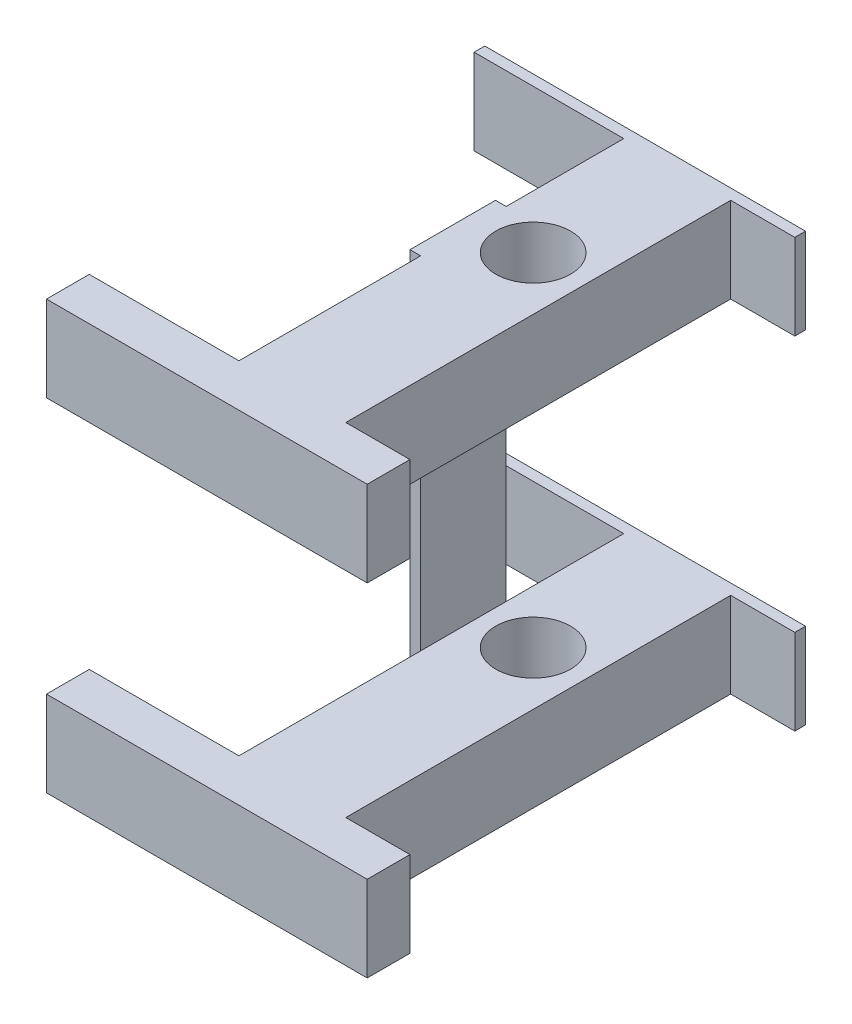
ISO-10303-21;
HEADER;
FILE_DESCRIPTION(('STEP AP214'),'2;1');
FILE_NAME('part.step','',(''),(''),'','','');
FILE_SCHEMA(('AUTOMOTIVE_DESIGN { 1 0 10303 214 1 1 1 1 }'));
ENDSEC;
DATA;
#1=APPLICATION_CONTEXT('core data for automotive mechanical design processes');
#2=APPLICATION_PROTOCOL_DEFINITION('international standard','automotive_design',2000,#1);
#3=PRODUCT_CONTEXT('',#1,'mechanical');
#4=PRODUCT('Part','Part','',(#3));
#5=PRODUCT_RELATED_PRODUCT_CATEGORY('part','',(#4));
#6=PRODUCT_DEFINITION_FORMATION('','',#4);
#7=PRODUCT_DEFINITION_CONTEXT('part definition',#1,'design');
#8=PRODUCT_DEFINITION('design','',#6,#7);
#9=PRODUCT_DEFINITION_SHAPE('','',#8);
#10=(LENGTH_UNIT() NAMED_UNIT(*) SI_UNIT(.MILLI.,.METRE.));
#11=(NAMED_UNIT(*) PLANE_ANGLE_UNIT() SI_UNIT($,.RADIAN.));
#12=(NAMED_UNIT(*) SI_UNIT($,.STERADIAN.) SOLID_ANGLE_UNIT());
#13=UNCERTAINTY_MEASURE_WITH_UNIT(LENGTH_MEASURE(1.E-05),#10,'distance_accuracy_value','');
#14=(GEOMETRIC_REPRESENTATION_CONTEXT(3) GLOBAL_UNCERTAINTY_ASSIGNED_CONTEXT((#13)) GLOBAL_UNIT_ASSIGNED_CONTEXT((#10,
#11,#12)) REPRESENTATION_CONTEXT('',''));
#15=CARTESIAN_POINT('',(0.,0.,0.));
#16=DIRECTION('',(0.,0.,1.));
#17=DIRECTION('',(1.,0.,0.));
#18=AXIS2_PLACEMENT_3D('',#15,#16,#17);
#19=CARTESIAN_POINT('',(88.9,0.,0.));
#20=DIRECTION('',(-1.,0.,0.));
#21=DIRECTION('',(0.,0.,1.));
#22=AXIS2_PLACEMENT_3D('',#19,#20,#21);
#23=PLANE('',#22);
#24=DIRECTION('',(0.,0.,-1.));
#25=VECTOR('',#24,1.);
#26=CARTESIAN_POINT('',(88.9,203.2,0.));
#27=LINE('',#26,#25);
#28=CARTESIAN_POINT('',(88.9,203.2,-107.95));
#29=VERTEX_POINT('',#28);
#30=CARTESIAN_POINT('',(88.9,203.2,-158.75));
#31=VERTEX_POINT('',#30);
#32=EDGE_CURVE('E63',#29,#31,#27,.T.);
#33=ORIENTED_EDGE('',*,*,#32,.F.);
#34=DIRECTION('',(0.,1.,0.));
#35=VECTOR('',#34,1.);
#36=CARTESIAN_POINT('',(88.9,0.,-107.95));
#37=LINE('',#36,#35);
#38=CARTESIAN_POINT('',(88.9,50.8,-107.95));
#39=VERTEX_POINT('',#38);
#40=EDGE_CURVE('E370',#39,#29,#37,.T.);
#41=ORIENTED_EDGE('',*,*,#40,.F.);
#42=DIRECTION('',(0.,0.,-1.));
#43=VECTOR('',#42,1.);
#44=CARTESIAN_POINT('',(88.9,50.8,0.));
#45=LINE('',#44,#43);
#46=CARTESIAN_POINT('',(88.9,50.8,-158.75));
#47=VERTEX_POINT('',#46);
#48=EDGE_CURVE('E470',#39,#47,#45,.T.);
#49=ORIENTED_EDGE('',*,*,#48,.T.);
#50=DIRECTION('',(0.,-1.,0.));
#51=VECTOR('',#50,1.);
#52=CARTESIAN_POINT('',(88.9,0.,-158.75));
#53=LINE('',#52,#51);
#54=EDGE_CURVE('E390',#31,#47,#53,.T.);
#55=ORIENTED_EDGE('',*,*,#54,.F.);
#56=EDGE_LOOP('',(#33,#41,#49,#55));
#57=FACE_BOUND('',#56,.T.);
#58=ADVANCED_FACE('F47',(#57),#23,.F.);
#59=CARTESIAN_POINT('',(88.9,50.8,0.));
#60=DIRECTION('',(-1.,0.,0.));
#61=DIRECTION('',(0.,0.,1.));
#62=AXIS2_PLACEMENT_3D('',#59,#60,#61);
#63=PLANE('',#62);
#64=CARTESIAN_POINT('',(88.9,50.8,0.));
#65=VERTEX_POINT('',#64);
#66=EDGE_CURVE('E465',#65,#39,#45,.T.);
#67=ORIENTED_EDGE('',*,*,#66,.T.);
#68=CARTESIAN_POINT('',(88.9,0.,-107.95));
#69=VERTEX_POINT('',#68);
#70=EDGE_CURVE('E386',#69,#39,#37,.T.);
#71=ORIENTED_EDGE('',*,*,#70,.F.);
#72=DIRECTION('',(0.,0.,-1.));
#73=VECTOR('',#72,1.);
#74=CARTESIAN_POINT('',(88.9,0.,0.));
#75=LINE('',#74,#73);
#76=CARTESIAN_POINT('',(88.9,0.,0.));
#77=VERTEX_POINT('',#76);
#78=EDGE_CURVE('E464',#77,#69,#75,.T.);
#79=ORIENTED_EDGE('',*,*,#78,.F.);
#80=DIRECTION('',(0.,-1.,0.));
#81=VECTOR('',#80,1.);
#82=CARTESIAN_POINT('',(88.9,50.8,0.));
#83=LINE('',#82,#81);
#84=EDGE_CURVE('E482',#65,#77,#83,.T.);
#85=ORIENTED_EDGE('',*,*,#84,.F.);
#86=EDGE_LOOP('',(#67,#71,#79,#85));
#87=FACE_BOUND('',#86,.T.);
#88=ADVANCED_FACE('F546',(#87),#63,.T.);
#89=CARTESIAN_POINT('',(88.9,0.,-158.75));
#90=VERTEX_POINT('',#89);
#91=CARTESIAN_POINT('',(88.9,0.,-228.6));
#92=VERTEX_POINT('',#91);
#93=EDGE_CURVE('E473',#90,#92,#75,.T.);
#94=ORIENTED_EDGE('',*,*,#93,.F.);
#95=DIRECTION('',(0.,1.,0.));
#96=VECTOR('',#95,1.);
#97=CARTESIAN_POINT('',(88.9,50.8,-158.75));
#98=LINE('',#97,#96);
#99=EDGE_CURVE('E11',#90,#47,#98,.T.);
#100=ORIENTED_EDGE('',*,*,#99,.T.);
#101=CARTESIAN_POINT('',(88.9,50.8,-228.6));
#102=VERTEX_POINT('',#101);
#103=EDGE_CURVE('E463',#47,#102,#45,.T.);
#104=ORIENTED_EDGE('',*,*,#103,.T.);
#105=DIRECTION('',(0.,-1.,0.));
#106=VECTOR('',#105,1.);
#107=CARTESIAN_POINT('',(88.9,50.8,-228.6));
#108=LINE('',#107,#106);
#109=EDGE_CURVE('E477',#102,#92,#108,.T.);
#110=ORIENTED_EDGE('',*,*,#109,.T.);
#111=EDGE_LOOP('',(#94,#100,#104,#110));
#112=FACE_BOUND('',#111,.T.);
#113=ADVANCED_FACE('F560',(#112),#63,.T.);
#114=CARTESIAN_POINT('',(0.,0.,0.));
#115=DIRECTION('',(0.,0.,-1.));
#116=DIRECTION('',(-1.,0.,0.));
#117=AXIS2_PLACEMENT_3D('',#114,#115,#116);
#118=PLANE('',#117);
#119=DIRECTION('',(-1.,0.,0.));
#120=VECTOR('',#119,1.);
#121=CARTESIAN_POINT('',(0.,50.8,0.));
#122=LINE('',#121,#120);
#123=CARTESIAN_POINT('',(0.,50.8,0.));
#124=VERTEX_POINT('',#123);
#125=EDGE_CURVE('E518',#65,#124,#122,.T.);
#126=ORIENTED_EDGE('',*,*,#125,.F.);
#127=ORIENTED_EDGE('',*,*,#84,.T.);
#128=DIRECTION('',(1.,0.,0.));
#129=VECTOR('',#128,1.);
#130=CARTESIAN_POINT('',(0.,0.,0.));
#131=LINE('',#130,#129);
#132=CARTESIAN_POINT('',(0.,0.,0.));
#133=VERTEX_POINT('',#132);
#134=EDGE_CURVE('E511',#133,#77,#131,.T.);
#135=ORIENTED_EDGE('',*,*,#134,.F.);
#136=DIRECTION('',(0.,-1.,0.));
#137=VECTOR('',#136,1.);
#138=CARTESIAN_POINT('',(0.,0.,0.));
#139=LINE('',#138,#137);
#140=EDGE_CURVE('E481',#124,#133,#139,.T.);
#141=ORIENTED_EDGE('',*,*,#140,.F.);
#142=EDGE_LOOP('',(#126,#127,#135,#141));
#143=FACE_BOUND('',#142,.T.);
#144=ADVANCED_FACE('F543',(#143),#118,.T.);
#145=CARTESIAN_POINT('',(0.,0.,25.4));
#146=DIRECTION('',(1.,0.,0.));
#147=DIRECTION('',(0.,0.,-1.));
#148=AXIS2_PLACEMENT_3D('',#145,#146,#147);
#149=PLANE('',#148);
#150=ORIENTED_EDGE('',*,*,#140,.T.);
#151=DIRECTION('',(0.,0.,-1.));
#152=VECTOR('',#151,1.);
#153=CARTESIAN_POINT('',(0.,0.,25.4));
#154=LINE('',#153,#152);
#155=CARTESIAN_POINT('',(0.,0.,25.4));
#156=VERTEX_POINT('',#155);
#157=EDGE_CURVE('E56',#156,#133,#154,.T.);
#158=ORIENTED_EDGE('',*,*,#157,.F.);
#159=DIRECTION('',(0.,-1.,0.));
#160=VECTOR('',#159,1.);
#161=CARTESIAN_POINT('',(0.,0.,25.4));
#162=LINE('',#161,#160);
#163=CARTESIAN_POINT('',(0.,50.8,25.4));
#164=VERTEX_POINT('',#163);
#165=EDGE_CURVE('E492',#164,#156,#162,.T.);
#166=ORIENTED_EDGE('',*,*,#165,.F.);
#167=DIRECTION('',(0.,0.,-1.));
#168=VECTOR('',#167,1.);
#169=CARTESIAN_POINT('',(0.,50.8,25.4));
#170=LINE('',#169,#168);
#171=EDGE_CURVE('E506',#164,#124,#170,.T.);
#172=ORIENTED_EDGE('',*,*,#171,.T.);
#173=EDGE_LOOP('',(#150,#158,#166,#172));
#174=FACE_BOUND('',#173,.T.);
#175=ADVANCED_FACE('F49',(#174),#149,.F.);
#176=CARTESIAN_POINT('',(0.,0.,25.4));
#177=DIRECTION('',(0.,1.,0.));
#178=DIRECTION('',(0.,0.,1.));
#179=AXIS2_PLACEMENT_3D('',#176,#177,#178);
#180=PLANE('',#179);
#181=CARTESIAN_POINT('',(120.65,0.,-143.027799697215));
#182=DIRECTION('',(0.,-1.,0.));
#183=DIRECTION('',(0.,0.,-1.));
#184=AXIS2_PLACEMENT_3D('',#181,#182,#183);
#185=CIRCLE('',#184,22.225);
#186=CARTESIAN_POINT('',(120.65,0.,-165.252799697215));
#187=VERTEX_POINT('',#186);
#188=EDGE_CURVE('E405',#187,#187,#185,.T.);
#189=ORIENTED_EDGE('',*,*,#188,.F.);
#190=EDGE_LOOP('',(#189));
#191=FACE_BOUND('',#190,.T.);
#192=ORIENTED_EDGE('',*,*,#134,.T.);
#193=ORIENTED_EDGE('',*,*,#78,.T.);
#194=DIRECTION('',(1.,0.,0.));
#195=VECTOR('',#194,1.);
#196=CARTESIAN_POINT('',(82.55,0.,-107.95));
#197=LINE('',#196,#195);
#198=CARTESIAN_POINT('',(82.55,0.,-107.95));
#199=VERTEX_POINT('',#198);
#200=EDGE_CURVE('E385',#199,#69,#197,.T.);
#201=ORIENTED_EDGE('',*,*,#200,.F.);
#202=DIRECTION('',(0.,0.,1.));
#203=VECTOR('',#202,1.);
#204=CARTESIAN_POINT('',(82.55,0.,-107.95));
#205=LINE('',#204,#203);
#206=CARTESIAN_POINT('',(82.55,0.,-158.75));
#207=VERTEX_POINT('',#206);
#208=EDGE_CURVE('E382',#207,#199,#205,.T.);
#209=ORIENTED_EDGE('',*,*,#208,.F.);
#210=DIRECTION('',(1.,0.,0.));
#211=VECTOR('',#210,1.);
#212=CARTESIAN_POINT('',(82.55,0.,-158.75));
#213=LINE('',#212,#211);
#214=EDGE_CURVE('E71',#207,#90,#213,.T.);
#215=ORIENTED_EDGE('',*,*,#214,.T.);
#216=ORIENTED_EDGE('',*,*,#93,.T.);
#217=DIRECTION('',(-1.,0.,0.));
#218=VECTOR('',#217,1.);
#219=CARTESIAN_POINT('',(190.5,0.,-228.6));
#220=LINE('',#219,#218);
#221=CARTESIAN_POINT('',(0.,0.,-228.6));
#222=VERTEX_POINT('',#221);
#223=EDGE_CURVE('E432',#92,#222,#220,.T.);
#224=ORIENTED_EDGE('',*,*,#223,.T.);
#225=DIRECTION('',(0.,0.,1.));
#226=VECTOR('',#225,1.);
#227=CARTESIAN_POINT('',(0.,0.,-234.95));
#228=LINE('',#227,#226);
#229=CARTESIAN_POINT('',(0.,0.,-234.95));
#230=VERTEX_POINT('',#229);
#231=EDGE_CURVE('E451',#230,#222,#228,.T.);
#232=ORIENTED_EDGE('',*,*,#231,.F.);
#233=DIRECTION('',(-1.,0.,0.));
#234=VECTOR('',#233,1.);
#235=CARTESIAN_POINT('',(190.5,0.,-234.95));
#236=LINE('',#235,#234);
#237=CARTESIAN_POINT('',(190.5,0.,-234.95));
#238=VERTEX_POINT('',#237);
#239=EDGE_CURVE('E418',#238,#230,#236,.T.);
#240=ORIENTED_EDGE('',*,*,#239,.F.);
#241=DIRECTION('',(0.,0.,1.));
#242=VECTOR('',#241,1.);
#243=CARTESIAN_POINT('',(190.5,0.,-234.95));
#244=LINE('',#243,#242);
#245=CARTESIAN_POINT('',(190.5,0.,-228.6));
#246=VERTEX_POINT('',#245);
#247=EDGE_CURVE('E455',#238,#246,#244,.T.);
#248=ORIENTED_EDGE('',*,*,#247,.T.);
#249=CARTESIAN_POINT('',(152.4,0.,-228.6));
#250=VERTEX_POINT('',#249);
#251=EDGE_CURVE('E433',#246,#250,#220,.T.);
#252=ORIENTED_EDGE('',*,*,#251,.T.);
#253=DIRECTION('',(0.,0.,-1.));
#254=VECTOR('',#253,1.);
#255=CARTESIAN_POINT('',(152.4,0.,0.));
#256=LINE('',#255,#254);
#257=CARTESIAN_POINT('',(152.4,0.,0.));
#258=VERTEX_POINT('',#257);
#259=EDGE_CURVE('E459',#258,#250,#256,.T.);
#260=ORIENTED_EDGE('',*,*,#259,.F.);
#261=CARTESIAN_POINT('',(190.5,0.,0.));
#262=VERTEX_POINT('',#261);
#263=EDGE_CURVE('E510',#258,#262,#131,.T.);
#264=ORIENTED_EDGE('',*,*,#263,.T.);
#265=DIRECTION('',(0.,0.,-1.));
#266=VECTOR('',#265,1.);
#267=CARTESIAN_POINT('',(190.5,0.,25.4));
#268=LINE('',#267,#266);
#269=CARTESIAN_POINT('',(190.5,0.,25.4));
#270=VERTEX_POINT('',#269);
#271=EDGE_CURVE('E529',#270,#262,#268,.T.);
#272=ORIENTED_EDGE('',*,*,#271,.F.);
#273=DIRECTION('',(1.,0.,0.));
#274=VECTOR('',#273,1.);
#275=CARTESIAN_POINT('',(0.,0.,25.4));
#276=LINE('',#275,#274);
#277=EDGE_CURVE('E496',#156,#270,#276,.T.);
#278=ORIENTED_EDGE('',*,*,#277,.F.);
#279=ORIENTED_EDGE('',*,*,#157,.T.);
#280=EDGE_LOOP('',(#192,#193,#201,#209,#215,#216,#224,#232,#240,#248,#252,#260,#264,#272,#278,#279));
#281=FACE_BOUND('',#280,.T.);
#282=ADVANCED_FACE('F535',(#191,#281),#180,.F.);
#283=CARTESIAN_POINT('',(190.5,0.,25.4));
#284=DIRECTION('',(-1.,0.,0.));
#285=DIRECTION('',(0.,0.,1.));
#286=AXIS2_PLACEMENT_3D('',#283,#284,#285);
#287=PLANE('',#286);
#288=DIRECTION('',(0.,1.,0.));
#289=VECTOR('',#288,1.);
#290=CARTESIAN_POINT('',(190.5,0.,0.));
#291=LINE('',#290,#289);
#292=CARTESIAN_POINT('',(190.5,50.8,0.));
#293=VERTEX_POINT('',#292);
#294=EDGE_CURVE('E515',#262,#293,#291,.T.);
#295=ORIENTED_EDGE('',*,*,#294,.T.);
#296=DIRECTION('',(0.,0.,-1.));
#297=VECTOR('',#296,1.);
#298=CARTESIAN_POINT('',(190.5,50.8,25.4));
#299=LINE('',#298,#297);
#300=CARTESIAN_POINT('',(190.5,50.8,25.4));
#301=VERTEX_POINT('',#300);
#302=EDGE_CURVE('E525',#301,#293,#299,.T.);
#303=ORIENTED_EDGE('',*,*,#302,.F.);
#304=DIRECTION('',(0.,1.,0.));
#305=VECTOR('',#304,1.);
#306=CARTESIAN_POINT('',(190.5,0.,25.4));
#307=LINE('',#306,#305);
#308=EDGE_CURVE('E500',#270,#301,#307,.T.);
#309=ORIENTED_EDGE('',*,*,#308,.F.);
#310=ORIENTED_EDGE('',*,*,#271,.T.);
#311=EDGE_LOOP('',(#295,#303,#309,#310));
#312=FACE_BOUND('',#311,.T.);
#313=ADVANCED_FACE('F709',(#312),#287,.F.);
#314=CARTESIAN_POINT('',(0.,50.8,25.4));
#315=DIRECTION('',(0.,-1.,0.));
#316=DIRECTION('',(0.,0.,-1.));
#317=AXIS2_PLACEMENT_3D('',#314,#315,#316);
#318=PLANE('',#317);
#319=CARTESIAN_POINT('',(120.65,50.8,-143.027799697215));
#320=DIRECTION('',(0.,-1.,0.));
#321=DIRECTION('',(0.,0.,-1.));
#322=AXIS2_PLACEMENT_3D('',#319,#320,#321);
#323=CIRCLE('',#322,22.225);
#324=CARTESIAN_POINT('',(120.65,50.8,-165.252799697215));
#325=VERTEX_POINT('',#324);
#326=EDGE_CURVE('E406',#325,#325,#323,.T.);
#327=ORIENTED_EDGE('',*,*,#326,.T.);
#328=EDGE_LOOP('',(#327));
#329=FACE_BOUND('',#328,.T.);
#330=CARTESIAN_POINT('',(152.4,50.8,0.));
#331=VERTEX_POINT('',#330);
#332=EDGE_CURVE('E497',#293,#331,#122,.T.);
#333=ORIENTED_EDGE('',*,*,#332,.T.);
#334=DIRECTION('',(0.,0.,-1.));
#335=VECTOR('',#334,1.);
#336=CARTESIAN_POINT('',(152.4,50.8,0.));
#337=LINE('',#336,#335);
#338=CARTESIAN_POINT('',(152.4,50.8,-228.6));
#339=VERTEX_POINT('',#338);
#340=EDGE_CURVE('E460',#331,#339,#337,.T.);
#341=ORIENTED_EDGE('',*,*,#340,.T.);
#342=DIRECTION('',(1.,0.,0.));
#343=VECTOR('',#342,1.);
#344=CARTESIAN_POINT('',(190.5,50.8,-228.6));
#345=LINE('',#344,#343);
#346=CARTESIAN_POINT('',(190.5,50.8,-228.6));
#347=VERTEX_POINT('',#346);
#348=EDGE_CURVE('E440',#339,#347,#345,.T.);
#349=ORIENTED_EDGE('',*,*,#348,.T.);
#350=DIRECTION('',(0.,0.,1.));
#351=VECTOR('',#350,1.);
#352=CARTESIAN_POINT('',(190.5,50.8,-234.95));
#353=LINE('',#352,#351);
#354=CARTESIAN_POINT('',(190.5,50.8,-234.95));
#355=VERTEX_POINT('',#354);
#356=EDGE_CURVE('E428',#355,#347,#353,.T.);
#357=ORIENTED_EDGE('',*,*,#356,.F.);
#358=DIRECTION('',(1.,0.,0.));
#359=VECTOR('',#358,1.);
#360=CARTESIAN_POINT('',(190.5,50.8,-234.95));
#361=LINE('',#360,#359);
#362=CARTESIAN_POINT('',(0.,50.8,-234.95));
#363=VERTEX_POINT('',#362);
#364=EDGE_CURVE('E425',#363,#355,#361,.T.);
#365=ORIENTED_EDGE('',*,*,#364,.F.);
#366=DIRECTION('',(0.,0.,1.));
#367=VECTOR('',#366,1.);
#368=CARTESIAN_POINT('',(0.,50.8,-234.95));
#369=LINE('',#368,#367);
#370=CARTESIAN_POINT('',(0.,50.8,-228.6));
#371=VERTEX_POINT('',#370);
#372=EDGE_CURVE('E447',#363,#371,#369,.T.);
#373=ORIENTED_EDGE('',*,*,#372,.T.);
#374=EDGE_CURVE('E419',#371,#102,#345,.T.);
#375=ORIENTED_EDGE('',*,*,#374,.T.);
#376=ORIENTED_EDGE('',*,*,#103,.F.);
#377=ORIENTED_EDGE('',*,*,#48,.F.);
#378=ORIENTED_EDGE('',*,*,#66,.F.);
#379=ORIENTED_EDGE('',*,*,#125,.T.);
#380=ORIENTED_EDGE('',*,*,#171,.F.);
#381=DIRECTION('',(-1.,0.,0.));
#382=VECTOR('',#381,1.);
#383=CARTESIAN_POINT('',(0.,50.8,25.4));
#384=LINE('',#383,#382);
#385=EDGE_CURVE('E503',#301,#164,#384,.T.);
#386=ORIENTED_EDGE('',*,*,#385,.F.);
#387=ORIENTED_EDGE('',*,*,#302,.T.);
#388=EDGE_LOOP('',(#333,#341,#349,#357,#365,#373,#375,#376,#377,#378,#379,#380,#386,#387));
#389=FACE_BOUND('',#388,.T.);
#390=ADVANCED_FACE('F550',(#329,#389),#318,.F.);
#391=CARTESIAN_POINT('',(0.,0.,25.4));
#392=DIRECTION('',(0.,0.,-1.));
#393=DIRECTION('',(-1.,0.,0.));
#394=AXIS2_PLACEMENT_3D('',#391,#392,#393);
#395=PLANE('',#394);
#396=ORIENTED_EDGE('',*,*,#165,.T.);
#397=ORIENTED_EDGE('',*,*,#277,.T.);
#398=ORIENTED_EDGE('',*,*,#308,.T.);
#399=ORIENTED_EDGE('',*,*,#385,.T.);
#400=EDGE_LOOP('',(#396,#397,#398,#399));
#401=FACE_BOUND('',#400,.T.);
#402=ADVANCED_FACE('F700',(#401),#395,.F.);
#403=DIRECTION('',(0.,-1.,0.));
#404=VECTOR('',#403,1.);
#405=CARTESIAN_POINT('',(152.4,50.8,0.));
#406=LINE('',#405,#404);
#407=EDGE_CURVE('E486',#331,#258,#406,.T.);
#408=ORIENTED_EDGE('',*,*,#407,.F.);
#409=ORIENTED_EDGE('',*,*,#332,.F.);
#410=ORIENTED_EDGE('',*,*,#294,.F.);
#411=ORIENTED_EDGE('',*,*,#263,.F.);
#412=EDGE_LOOP('',(#408,#409,#410,#411));
#413=FACE_BOUND('',#412,.T.);
#414=ADVANCED_FACE('F698',(#413),#118,.T.);
#415=CARTESIAN_POINT('',(152.4,50.8,0.));
#416=DIRECTION('',(-1.,0.,0.));
#417=DIRECTION('',(0.,0.,1.));
#418=AXIS2_PLACEMENT_3D('',#415,#416,#417);
#419=PLANE('',#418);
#420=ORIENTED_EDGE('',*,*,#259,.T.);
#421=DIRECTION('',(0.,-1.,0.));
#422=VECTOR('',#421,1.);
#423=CARTESIAN_POINT('',(152.4,50.8,-228.6));
#424=LINE('',#423,#422);
#425=EDGE_CURVE('E469',#339,#250,#424,.T.);
#426=ORIENTED_EDGE('',*,*,#425,.F.);
#427=ORIENTED_EDGE('',*,*,#340,.F.);
#428=ORIENTED_EDGE('',*,*,#407,.T.);
#429=EDGE_LOOP('',(#420,#426,#427,#428));
#430=FACE_BOUND('',#429,.T.);
#431=ADVANCED_FACE('F695',(#430),#419,.F.);
#432=CARTESIAN_POINT('',(0.,0.,-228.6));
#433=DIRECTION('',(0.,0.,1.));
#434=DIRECTION('',(1.,0.,0.));
#435=AXIS2_PLACEMENT_3D('',#432,#433,#434);
#436=PLANE('',#435);
#437=ORIENTED_EDGE('',*,*,#109,.F.);
#438=ORIENTED_EDGE('',*,*,#374,.F.);
#439=DIRECTION('',(0.,1.,0.));
#440=VECTOR('',#439,1.);
#441=CARTESIAN_POINT('',(0.,0.,-228.6));
#442=LINE('',#441,#440);
#443=EDGE_CURVE('E437',#222,#371,#442,.T.);
#444=ORIENTED_EDGE('',*,*,#443,.F.);
#445=ORIENTED_EDGE('',*,*,#223,.F.);
#446=EDGE_LOOP('',(#437,#438,#444,#445));
#447=FACE_BOUND('',#446,.T.);
#448=ADVANCED_FACE('F564',(#447),#436,.T.);
#449=CARTESIAN_POINT('',(190.5,0.,-234.95));
#450=DIRECTION('',(-1.,0.,0.));
#451=DIRECTION('',(0.,0.,1.));
#452=AXIS2_PLACEMENT_3D('',#449,#450,#451);
#453=PLANE('',#452);
#454=DIRECTION('',(0.,-1.,0.));
#455=VECTOR('',#454,1.);
#456=CARTESIAN_POINT('',(190.5,0.,-228.6));
#457=LINE('',#456,#455);
#458=EDGE_CURVE('E410',#347,#246,#457,.T.);
#459=ORIENTED_EDGE('',*,*,#458,.T.);
#460=ORIENTED_EDGE('',*,*,#247,.F.);
#461=DIRECTION('',(0.,-1.,0.));
#462=VECTOR('',#461,1.);
#463=CARTESIAN_POINT('',(190.5,0.,-234.95));
#464=LINE('',#463,#462);
#465=EDGE_CURVE('E414',#355,#238,#464,.T.);
#466=ORIENTED_EDGE('',*,*,#465,.F.);
#467=ORIENTED_EDGE('',*,*,#356,.T.);
#468=EDGE_LOOP('',(#459,#460,#466,#467));
#469=FACE_BOUND('',#468,.T.);
#470=ADVANCED_FACE('F691',(#469),#453,.F.);
#471=CARTESIAN_POINT('',(0.,0.,-234.95));
#472=DIRECTION('',(1.,0.,0.));
#473=DIRECTION('',(0.,0.,-1.));
#474=AXIS2_PLACEMENT_3D('',#471,#472,#473);
#475=PLANE('',#474);
#476=ORIENTED_EDGE('',*,*,#443,.T.);
#477=ORIENTED_EDGE('',*,*,#372,.F.);
#478=DIRECTION('',(0.,1.,0.));
#479=VECTOR('',#478,1.);
#480=CARTESIAN_POINT('',(0.,0.,-234.95));
#481=LINE('',#480,#479);
#482=EDGE_CURVE('E422',#230,#363,#481,.T.);
#483=ORIENTED_EDGE('',*,*,#482,.F.);
#484=ORIENTED_EDGE('',*,*,#231,.T.);
#485=EDGE_LOOP('',(#476,#477,#483,#484));
#486=FACE_BOUND('',#485,.T.);
#487=ADVANCED_FACE('F571',(#486),#475,.F.);
#488=CARTESIAN_POINT('',(0.,0.,-234.95));
#489=DIRECTION('',(0.,0.,1.));
#490=DIRECTION('',(1.,0.,0.));
#491=AXIS2_PLACEMENT_3D('',#488,#489,#490);
#492=PLANE('',#491);
#493=ORIENTED_EDGE('',*,*,#465,.T.);
#494=ORIENTED_EDGE('',*,*,#239,.T.);
#495=ORIENTED_EDGE('',*,*,#482,.T.);
#496=ORIENTED_EDGE('',*,*,#364,.T.);
#497=EDGE_LOOP('',(#493,#494,#495,#496));
#498=FACE_BOUND('',#497,.T.);
#499=ADVANCED_FACE('F682',(#498),#492,.F.);
#500=ORIENTED_EDGE('',*,*,#348,.F.);
#501=ORIENTED_EDGE('',*,*,#425,.T.);
#502=ORIENTED_EDGE('',*,*,#251,.F.);
#503=ORIENTED_EDGE('',*,*,#458,.F.);
#504=EDGE_LOOP('',(#500,#501,#502,#503));
#505=FACE_BOUND('',#504,.T.);
#506=ADVANCED_FACE('F680',(#505),#436,.T.);
#507=CARTESIAN_POINT('',(120.65,50.8,-143.027799697215));
#508=DIRECTION('',(0.,-1.,0.));
#509=DIRECTION('',(0.,0.,-1.));
#510=AXIS2_PLACEMENT_3D('',#507,#508,#509);
#511=CYLINDRICAL_SURFACE('',#510,22.225);
#512=ORIENTED_EDGE('',*,*,#326,.F.);
#513=EDGE_LOOP('',(#512));
#514=FACE_BOUND('',#513,.T.);
#515=ORIENTED_EDGE('',*,*,#188,.T.);
#516=EDGE_LOOP('',(#515));
#517=FACE_BOUND('',#516,.T.);
#518=ADVANCED_FACE('F677',(#514,#517),#511,.F.);
#519=CARTESIAN_POINT('',(82.55,0.,-107.95));
#520=DIRECTION('',(0.,0.,-1.));
#521=DIRECTION('',(-1.,0.,0.));
#522=AXIS2_PLACEMENT_3D('',#519,#520,#521);
#523=PLANE('',#522);
#524=ORIENTED_EDGE('',*,*,#70,.T.);
#525=ORIENTED_EDGE('',*,*,#40,.T.);
#526=DIRECTION('',(0.,1.,0.));
#527=VECTOR('',#526,1.);
#528=CARTESIAN_POINT('',(88.9,0.,-107.95));
#529=LINE('',#528,#527);
#530=CARTESIAN_POINT('',(88.9,254.,-107.95));
#531=VERTEX_POINT('',#530);
#532=EDGE_CURVE('E356',#29,#531,#529,.T.);
#533=ORIENTED_EDGE('',*,*,#532,.T.);
#534=DIRECTION('',(1.,0.,0.));
#535=VECTOR('',#534,1.);
#536=CARTESIAN_POINT('',(82.55,254.,-107.95));
#537=LINE('',#536,#535);
#538=CARTESIAN_POINT('',(82.55,254.,-107.95));
#539=VERTEX_POINT('',#538);
#540=EDGE_CURVE('E402',#539,#531,#537,.T.);
#541=ORIENTED_EDGE('',*,*,#540,.F.);
#542=DIRECTION('',(0.,1.,0.));
#543=VECTOR('',#542,1.);
#544=CARTESIAN_POINT('',(82.55,0.,-107.95));
#545=LINE('',#544,#543);
#546=EDGE_CURVE('E371',#199,#539,#545,.T.);
#547=ORIENTED_EDGE('',*,*,#546,.F.);
#548=ORIENTED_EDGE('',*,*,#200,.T.);
#549=EDGE_LOOP('',(#524,#525,#533,#541,#547,#548));
#550=FACE_BOUND('',#549,.T.);
#551=ADVANCED_FACE('F645',(#550),#523,.F.);
#552=CARTESIAN_POINT('',(82.55,254.,-107.95));
#553=DIRECTION('',(0.,-1.,0.));
#554=DIRECTION('',(0.,0.,-1.));
#555=AXIS2_PLACEMENT_3D('',#552,#553,#554);
#556=PLANE('',#555);
#557=CARTESIAN_POINT('',(120.65,254.,-143.027799697215));
#558=DIRECTION('',(0.,-1.,0.));
#559=DIRECTION('',(0.,0.,-1.));
#560=AXIS2_PLACEMENT_3D('',#557,#558,#559);
#561=CIRCLE('',#560,22.225);
#562=CARTESIAN_POINT('',(120.65,254.,-165.252799697215));
#563=VERTEX_POINT('',#562);
#564=EDGE_CURVE('E282',#563,#563,#561,.T.);
#565=ORIENTED_EDGE('',*,*,#564,.T.);
#566=EDGE_LOOP('',(#565));
#567=FACE_BOUND('',#566,.T.);
#568=ORIENTED_EDGE('',*,*,#540,.T.);
#569=DIRECTION('',(0.,0.,-1.));
#570=VECTOR('',#569,1.);
#571=CARTESIAN_POINT('',(88.9,254.,0.));
#572=LINE('',#571,#570);
#573=CARTESIAN_POINT('',(88.9,254.,0.));
#574=VERTEX_POINT('',#573);
#575=EDGE_CURVE('E343',#574,#531,#572,.T.);
#576=ORIENTED_EDGE('',*,*,#575,.F.);
#577=DIRECTION('',(-1.,0.,0.));
#578=VECTOR('',#577,1.);
#579=CARTESIAN_POINT('',(190.5,254.,0.));
#580=LINE('',#579,#578);
#581=CARTESIAN_POINT('',(0.,254.,0.));
#582=VERTEX_POINT('',#581);
#583=EDGE_CURVE('E638',#574,#582,#580,.T.);
#584=ORIENTED_EDGE('',*,*,#583,.T.);
#585=DIRECTION('',(0.,0.,-1.));
#586=VECTOR('',#585,1.);
#587=CARTESIAN_POINT('',(0.,254.,25.4));
#588=LINE('',#587,#586);
#589=CARTESIAN_POINT('',(0.,254.,25.4));
#590=VERTEX_POINT('',#589);
#591=EDGE_CURVE('E256',#590,#582,#588,.T.);
#592=ORIENTED_EDGE('',*,*,#591,.F.);
#593=DIRECTION('',(-1.,0.,0.));
#594=VECTOR('',#593,1.);
#595=CARTESIAN_POINT('',(190.5,254.,25.4));
#596=LINE('',#595,#594);
#597=CARTESIAN_POINT('',(190.5,254.,25.4));
#598=VERTEX_POINT('',#597);
#599=EDGE_CURVE('E247',#598,#590,#596,.T.);
#600=ORIENTED_EDGE('',*,*,#599,.F.);
#601=DIRECTION('',(0.,0.,-1.));
#602=VECTOR('',#601,1.);
#603=CARTESIAN_POINT('',(190.5,254.,25.4));
#604=LINE('',#603,#602);
#605=CARTESIAN_POINT('',(190.5,254.,0.));
#606=VERTEX_POINT('',#605);
#607=EDGE_CURVE('E253',#598,#606,#604,.T.);
#608=ORIENTED_EDGE('',*,*,#607,.T.);
#609=CARTESIAN_POINT('',(152.4,254.,0.));
#610=VERTEX_POINT('',#609);
#611=EDGE_CURVE('E623',#606,#610,#580,.T.);
#612=ORIENTED_EDGE('',*,*,#611,.T.);
#613=DIRECTION('',(0.,0.,-1.));
#614=VECTOR('',#613,1.);
#615=CARTESIAN_POINT('',(152.4,254.,0.));
#616=LINE('',#615,#614);
#617=CARTESIAN_POINT('',(152.4,254.,-228.6));
#618=VERTEX_POINT('',#617);
#619=EDGE_CURVE('E338',#610,#618,#616,.T.);
#620=ORIENTED_EDGE('',*,*,#619,.T.);
#621=DIRECTION('',(1.,0.,0.));
#622=VECTOR('',#621,1.);
#623=CARTESIAN_POINT('',(190.5,254.,-228.6));
#624=LINE('',#623,#622);
#625=CARTESIAN_POINT('',(190.5,254.,-228.6));
#626=VERTEX_POINT('',#625);
#627=EDGE_CURVE('E318',#618,#626,#624,.T.);
#628=ORIENTED_EDGE('',*,*,#627,.T.);
#629=DIRECTION('',(0.,0.,1.));
#630=VECTOR('',#629,1.);
#631=CARTESIAN_POINT('',(190.5,254.,-234.95));
#632=LINE('',#631,#630);
#633=CARTESIAN_POINT('',(190.5,254.,-234.95));
#634=VERTEX_POINT('',#633);
#635=EDGE_CURVE('E306',#634,#626,#632,.T.);
#636=ORIENTED_EDGE('',*,*,#635,.F.);
#637=DIRECTION('',(1.,0.,0.));
#638=VECTOR('',#637,1.);
#639=CARTESIAN_POINT('',(190.5,254.,-234.95));
#640=LINE('',#639,#638);
#641=CARTESIAN_POINT('',(0.,254.,-234.95));
#642=VERTEX_POINT('',#641);
#643=EDGE_CURVE('E303',#642,#634,#640,.T.);
#644=ORIENTED_EDGE('',*,*,#643,.F.);
#645=DIRECTION('',(0.,0.,1.));
#646=VECTOR('',#645,1.);
#647=CARTESIAN_POINT('',(0.,254.,-234.95));
#648=LINE('',#647,#646);
#649=CARTESIAN_POINT('',(0.,254.,-228.6));
#650=VERTEX_POINT('',#649);
#651=EDGE_CURVE('E325',#642,#650,#648,.T.);
#652=ORIENTED_EDGE('',*,*,#651,.T.);
#653=CARTESIAN_POINT('',(88.9,254.,-228.6));
#654=VERTEX_POINT('',#653);
#655=EDGE_CURVE('E297',#650,#654,#624,.T.);
#656=ORIENTED_EDGE('',*,*,#655,.T.);
#657=CARTESIAN_POINT('',(88.9,254.,-158.75));
#658=VERTEX_POINT('',#657);
#659=EDGE_CURVE('E341',#658,#654,#572,.T.);
#660=ORIENTED_EDGE('',*,*,#659,.F.);
#661=DIRECTION('',(1.,0.,0.));
#662=VECTOR('',#661,1.);
#663=CARTESIAN_POINT('',(82.55,254.,-158.75));
#664=LINE('',#663,#662);
#665=CARTESIAN_POINT('',(82.55,254.,-158.75));
#666=VERTEX_POINT('',#665);
#667=EDGE_CURVE('E398',#666,#658,#664,.T.);
#668=ORIENTED_EDGE('',*,*,#667,.F.);
#669=DIRECTION('',(0.,0.,-1.));
#670=VECTOR('',#669,1.);
#671=CARTESIAN_POINT('',(82.55,254.,-107.95));
#672=LINE('',#671,#670);
#673=EDGE_CURVE('E375',#539,#666,#672,.T.);
#674=ORIENTED_EDGE('',*,*,#673,.F.);
#675=EDGE_LOOP('',(#568,#576,#584,#592,#600,#608,#612,#620,#628,#636,#644,#652,#656,#660,#668,#674));
#676=FACE_BOUND('',#675,.T.);
#677=ADVANCED_FACE('F250',(#567,#676),#556,.F.);
#678=CARTESIAN_POINT('',(82.55,0.,-158.75));
#679=DIRECTION('',(0.,0.,1.));
#680=DIRECTION('',(1.,0.,0.));
#681=AXIS2_PLACEMENT_3D('',#678,#679,#680);
#682=PLANE('',#681);
#683=EDGE_CURVE('E376',#658,#31,#53,.T.);
#684=ORIENTED_EDGE('',*,*,#683,.T.);
#685=ORIENTED_EDGE('',*,*,#54,.T.);
#686=ORIENTED_EDGE('',*,*,#99,.F.);
#687=ORIENTED_EDGE('',*,*,#214,.F.);
#688=DIRECTION('',(0.,-1.,0.));
#689=VECTOR('',#688,1.);
#690=CARTESIAN_POINT('',(82.55,0.,-158.75));
#691=LINE('',#690,#689);
#692=EDGE_CURVE('E379',#666,#207,#691,.T.);
#693=ORIENTED_EDGE('',*,*,#692,.F.);
#694=ORIENTED_EDGE('',*,*,#667,.T.);
#695=EDGE_LOOP('',(#684,#685,#686,#687,#693,#694));
#696=FACE_BOUND('',#695,.T.);
#697=ADVANCED_FACE('F647',(#696),#682,.F.);
#698=CARTESIAN_POINT('',(82.55,0.,0.));
#699=DIRECTION('',(-1.,0.,0.));
#700=DIRECTION('',(0.,0.,1.));
#701=AXIS2_PLACEMENT_3D('',#698,#699,#700);
#702=PLANE('',#701);
#703=ORIENTED_EDGE('',*,*,#546,.T.);
#704=ORIENTED_EDGE('',*,*,#673,.T.);
#705=ORIENTED_EDGE('',*,*,#692,.T.);
#706=ORIENTED_EDGE('',*,*,#208,.T.);
#707=EDGE_LOOP('',(#703,#704,#705,#706));
#708=FACE_BOUND('',#707,.T.);
#709=ADVANCED_FACE('F660',(#708),#702,.T.);
#710=CARTESIAN_POINT('',(88.9,254.,0.));
#711=DIRECTION('',(-1.,0.,0.));
#712=DIRECTION('',(0.,0.,1.));
#713=AXIS2_PLACEMENT_3D('',#710,#711,#712);
#714=PLANE('',#713);
#715=ORIENTED_EDGE('',*,*,#532,.F.);
#716=CARTESIAN_POINT('',(88.9,203.2,0.));
#717=VERTEX_POINT('',#716);
#718=EDGE_CURVE('E342',#717,#29,#27,.T.);
#719=ORIENTED_EDGE('',*,*,#718,.F.);
#720=DIRECTION('',(0.,-1.,0.));
#721=VECTOR('',#720,1.);
#722=CARTESIAN_POINT('',(88.9,254.,0.));
#723=LINE('',#722,#721);
#724=EDGE_CURVE('E357',#574,#717,#723,.T.);
#725=ORIENTED_EDGE('',*,*,#724,.F.);
#726=ORIENTED_EDGE('',*,*,#575,.T.);
#727=EDGE_LOOP('',(#715,#719,#725,#726));
#728=FACE_BOUND('',#727,.T.);
#729=ADVANCED_FACE('F641',(#728),#714,.T.);
#730=ORIENTED_EDGE('',*,*,#683,.F.);
#731=ORIENTED_EDGE('',*,*,#659,.T.);
#732=DIRECTION('',(0.,-1.,0.));
#733=VECTOR('',#732,1.);
#734=CARTESIAN_POINT('',(88.9,254.,-228.6));
#735=LINE('',#734,#733);
#736=CARTESIAN_POINT('',(88.9,203.2,-228.6));
#737=VERTEX_POINT('',#736);
#738=EDGE_CURVE('E352',#654,#737,#735,.T.);
#739=ORIENTED_EDGE('',*,*,#738,.T.);
#740=EDGE_CURVE('E349',#31,#737,#27,.T.);
#741=ORIENTED_EDGE('',*,*,#740,.F.);
#742=EDGE_LOOP('',(#730,#731,#739,#741));
#743=FACE_BOUND('',#742,.T.);
#744=ADVANCED_FACE('F650',(#743),#714,.T.);
#745=CARTESIAN_POINT('',(152.4,254.,0.));
#746=DIRECTION('',(-1.,0.,0.));
#747=DIRECTION('',(0.,0.,1.));
#748=AXIS2_PLACEMENT_3D('',#745,#746,#747);
#749=PLANE('',#748);
#750=DIRECTION('',(0.,0.,-1.));
#751=VECTOR('',#750,1.);
#752=CARTESIAN_POINT('',(152.4,203.2,0.));
#753=LINE('',#752,#751);
#754=CARTESIAN_POINT('',(152.4,203.2,0.));
#755=VERTEX_POINT('',#754);
#756=CARTESIAN_POINT('',(152.4,203.2,-228.6));
#757=VERTEX_POINT('',#756);
#758=EDGE_CURVE('E337',#755,#757,#753,.T.);
#759=ORIENTED_EDGE('',*,*,#758,.T.);
#760=DIRECTION('',(0.,-1.,0.));
#761=VECTOR('',#760,1.);
#762=CARTESIAN_POINT('',(152.4,254.,-228.6));
#763=LINE('',#762,#761);
#764=EDGE_CURVE('E346',#618,#757,#763,.T.);
#765=ORIENTED_EDGE('',*,*,#764,.F.);
#766=ORIENTED_EDGE('',*,*,#619,.F.);
#767=DIRECTION('',(0.,-1.,0.));
#768=VECTOR('',#767,1.);
#769=CARTESIAN_POINT('',(152.4,254.,0.));
#770=LINE('',#769,#768);
#771=EDGE_CURVE('E361',#610,#755,#770,.T.);
#772=ORIENTED_EDGE('',*,*,#771,.T.);
#773=EDGE_LOOP('',(#759,#765,#766,#772));
#774=FACE_BOUND('',#773,.T.);
#775=ADVANCED_FACE('F611',(#774),#749,.F.);
#776=CARTESIAN_POINT('',(0.,203.2,0.));
#777=DIRECTION('',(0.,1.,0.));
#778=DIRECTION('',(0.,0.,1.));
#779=AXIS2_PLACEMENT_3D('',#776,#777,#778);
#780=PLANE('',#779);
#781=CARTESIAN_POINT('',(120.65,203.2,-143.027799697215));
#782=DIRECTION('',(0.,-1.,0.));
#783=DIRECTION('',(0.,0.,-1.));
#784=AXIS2_PLACEMENT_3D('',#781,#782,#783);
#785=CIRCLE('',#784,22.225);
#786=CARTESIAN_POINT('',(120.65,203.2,-165.252799697215));
#787=VERTEX_POINT('',#786);
#788=EDGE_CURVE('E277',#787,#787,#785,.T.);
#789=ORIENTED_EDGE('',*,*,#788,.F.);
#790=EDGE_LOOP('',(#789));
#791=FACE_BOUND('',#790,.T.);
#792=ORIENTED_EDGE('',*,*,#740,.T.);
#793=DIRECTION('',(-1.,0.,0.));
#794=VECTOR('',#793,1.);
#795=CARTESIAN_POINT('',(190.5,203.2,-228.6));
#796=LINE('',#795,#794);
#797=CARTESIAN_POINT('',(0.,203.2,-228.6));
#798=VERTEX_POINT('',#797);
#799=EDGE_CURVE('E310',#737,#798,#796,.T.);
#800=ORIENTED_EDGE('',*,*,#799,.T.);
#801=DIRECTION('',(0.,0.,1.));
#802=VECTOR('',#801,1.);
#803=CARTESIAN_POINT('',(0.,203.2,-234.95));
#804=LINE('',#803,#802);
#805=CARTESIAN_POINT('',(0.,203.2,-234.95));
#806=VERTEX_POINT('',#805);
#807=EDGE_CURVE('E329',#806,#798,#804,.T.);
#808=ORIENTED_EDGE('',*,*,#807,.F.);
#809=DIRECTION('',(-1.,0.,0.));
#810=VECTOR('',#809,1.);
#811=CARTESIAN_POINT('',(190.5,203.2,-234.95));
#812=LINE('',#811,#810);
#813=CARTESIAN_POINT('',(190.5,203.2,-234.95));
#814=VERTEX_POINT('',#813);
#815=EDGE_CURVE('E296',#814,#806,#812,.T.);
#816=ORIENTED_EDGE('',*,*,#815,.F.);
#817=DIRECTION('',(0.,0.,1.));
#818=VECTOR('',#817,1.);
#819=CARTESIAN_POINT('',(190.5,203.2,-234.95));
#820=LINE('',#819,#818);
#821=CARTESIAN_POINT('',(190.5,203.2,-228.6));
#822=VERTEX_POINT('',#821);
#823=EDGE_CURVE('E333',#814,#822,#820,.T.);
#824=ORIENTED_EDGE('',*,*,#823,.T.);
#825=EDGE_CURVE('E311',#822,#757,#796,.T.);
#826=ORIENTED_EDGE('',*,*,#825,.T.);
#827=ORIENTED_EDGE('',*,*,#758,.F.);
#828=DIRECTION('',(1.,0.,0.));
#829=VECTOR('',#828,1.);
#830=CARTESIAN_POINT('',(190.5,203.2,0.));
#831=LINE('',#830,#829);
#832=CARTESIAN_POINT('',(190.5,203.2,0.));
#833=VERTEX_POINT('',#832);
#834=EDGE_CURVE('E614',#755,#833,#831,.T.);
#835=ORIENTED_EDGE('',*,*,#834,.T.);
#836=DIRECTION('',(0.,0.,-1.));
#837=VECTOR('',#836,1.);
#838=CARTESIAN_POINT('',(190.5,203.2,25.4));
#839=LINE('',#838,#837);
#840=CARTESIAN_POINT('',(190.5,203.2,25.4));
#841=VERTEX_POINT('',#840);
#842=EDGE_CURVE('E627',#841,#833,#839,.T.);
#843=ORIENTED_EDGE('',*,*,#842,.F.);
#844=DIRECTION('',(1.,0.,0.));
#845=VECTOR('',#844,1.);
#846=CARTESIAN_POINT('',(190.5,203.2,25.4));
#847=LINE('',#846,#845);
#848=CARTESIAN_POINT('',(0.,203.2,25.4));
#849=VERTEX_POINT('',#848);
#850=EDGE_CURVE('E266',#849,#841,#847,.T.);
#851=ORIENTED_EDGE('',*,*,#850,.F.);
#852=DIRECTION('',(0.,0.,-1.));
#853=VECTOR('',#852,1.);
#854=CARTESIAN_POINT('',(0.,203.2,25.4));
#855=LINE('',#854,#853);
#856=CARTESIAN_POINT('',(0.,203.2,0.));
#857=VERTEX_POINT('',#856);
#858=EDGE_CURVE('E284',#849,#857,#855,.T.);
#859=ORIENTED_EDGE('',*,*,#858,.T.);
#860=EDGE_CURVE('E271',#857,#717,#831,.T.);
#861=ORIENTED_EDGE('',*,*,#860,.T.);
#862=ORIENTED_EDGE('',*,*,#718,.T.);
#863=ORIENTED_EDGE('',*,*,#32,.T.);
#864=EDGE_LOOP('',(#792,#800,#808,#816,#824,#826,#827,#835,#843,#851,#859,#861,#862,#863));
#865=FACE_BOUND('',#864,.T.);
#866=ADVANCED_FACE('F584',(#791,#865),#780,.F.);
#867=CARTESIAN_POINT('',(0.,203.2,-228.6));
#868=DIRECTION('',(0.,0.,1.));
#869=DIRECTION('',(1.,0.,0.));
#870=AXIS2_PLACEMENT_3D('',#867,#868,#869);
#871=PLANE('',#870);
#872=ORIENTED_EDGE('',*,*,#738,.F.);
#873=ORIENTED_EDGE('',*,*,#655,.F.);
#874=DIRECTION('',(0.,1.,0.));
#875=VECTOR('',#874,1.);
#876=CARTESIAN_POINT('',(0.,203.2,-228.6));
#877=LINE('',#876,#875);
#878=EDGE_CURVE('E315',#798,#650,#877,.T.);
#879=ORIENTED_EDGE('',*,*,#878,.F.);
#880=ORIENTED_EDGE('',*,*,#799,.F.);
#881=EDGE_LOOP('',(#872,#873,#879,#880));
#882=FACE_BOUND('',#881,.T.);
#883=ADVANCED_FACE('F593',(#882),#871,.T.);
#884=CARTESIAN_POINT('',(190.5,203.2,-234.95));
#885=DIRECTION('',(-1.,0.,0.));
#886=DIRECTION('',(0.,0.,1.));
#887=AXIS2_PLACEMENT_3D('',#884,#885,#886);
#888=PLANE('',#887);
#889=DIRECTION('',(0.,-1.,0.));
#890=VECTOR('',#889,1.);
#891=CARTESIAN_POINT('',(190.5,203.2,-228.6));
#892=LINE('',#891,#890);
#893=EDGE_CURVE('E290',#626,#822,#892,.T.);
#894=ORIENTED_EDGE('',*,*,#893,.T.);
#895=ORIENTED_EDGE('',*,*,#823,.F.);
#896=DIRECTION('',(0.,-1.,0.));
#897=VECTOR('',#896,1.);
#898=CARTESIAN_POINT('',(190.5,203.2,-234.95));
#899=LINE('',#898,#897);
#900=EDGE_CURVE('E292',#634,#814,#899,.T.);
#901=ORIENTED_EDGE('',*,*,#900,.F.);
#902=ORIENTED_EDGE('',*,*,#635,.T.);
#903=EDGE_LOOP('',(#894,#895,#901,#902));
#904=FACE_BOUND('',#903,.T.);
#905=ADVANCED_FACE('F605',(#904),#888,.F.);
#906=CARTESIAN_POINT('',(0.,203.2,-234.95));
#907=DIRECTION('',(1.,0.,0.));
#908=DIRECTION('',(0.,0.,-1.));
#909=AXIS2_PLACEMENT_3D('',#906,#907,#908);
#910=PLANE('',#909);
#911=ORIENTED_EDGE('',*,*,#878,.T.);
#912=ORIENTED_EDGE('',*,*,#651,.F.);
#913=DIRECTION('',(0.,1.,0.));
#914=VECTOR('',#913,1.);
#915=CARTESIAN_POINT('',(0.,203.2,-234.95));
#916=LINE('',#915,#914);
#917=EDGE_CURVE('E300',#806,#642,#916,.T.);
#918=ORIENTED_EDGE('',*,*,#917,.F.);
#919=ORIENTED_EDGE('',*,*,#807,.T.);
#920=EDGE_LOOP('',(#911,#912,#918,#919));
#921=FACE_BOUND('',#920,.T.);
#922=ADVANCED_FACE('F590',(#921),#910,.F.);
#923=CARTESIAN_POINT('',(0.,203.2,-234.95));
#924=DIRECTION('',(0.,0.,1.));
#925=DIRECTION('',(1.,0.,0.));
#926=AXIS2_PLACEMENT_3D('',#923,#924,#925);
#927=PLANE('',#926);
#928=ORIENTED_EDGE('',*,*,#900,.T.);
#929=ORIENTED_EDGE('',*,*,#815,.T.);
#930=ORIENTED_EDGE('',*,*,#917,.T.);
#931=ORIENTED_EDGE('',*,*,#643,.T.);
#932=EDGE_LOOP('',(#928,#929,#930,#931));
#933=FACE_BOUND('',#932,.T.);
#934=ADVANCED_FACE('F600',(#933),#927,.F.);
#935=ORIENTED_EDGE('',*,*,#627,.F.);
#936=ORIENTED_EDGE('',*,*,#764,.T.);
#937=ORIENTED_EDGE('',*,*,#825,.F.);
#938=ORIENTED_EDGE('',*,*,#893,.F.);
#939=EDGE_LOOP('',(#935,#936,#937,#938));
#940=FACE_BOUND('',#939,.T.);
#941=ADVANCED_FACE('F608',(#940),#871,.T.);
#942=CARTESIAN_POINT('',(120.65,254.,-143.027799697215));
#943=DIRECTION('',(0.,-1.,0.));
#944=DIRECTION('',(0.,0.,-1.));
#945=AXIS2_PLACEMENT_3D('',#942,#943,#944);
#946=CYLINDRICAL_SURFACE('',#945,22.225);
#947=ORIENTED_EDGE('',*,*,#564,.F.);
#948=EDGE_LOOP('',(#947));
#949=FACE_BOUND('',#948,.T.);
#950=ORIENTED_EDGE('',*,*,#788,.T.);
#951=EDGE_LOOP('',(#950));
#952=FACE_BOUND('',#951,.T.);
#953=ADVANCED_FACE('F901',(#949,#952),#946,.F.);
#954=CARTESIAN_POINT('',(0.,0.,0.));
#955=DIRECTION('',(0.,0.,-1.));
#956=DIRECTION('',(-1.,0.,0.));
#957=AXIS2_PLACEMENT_3D('',#954,#955,#956);
#958=PLANE('',#957);
#959=ORIENTED_EDGE('',*,*,#771,.F.);
#960=ORIENTED_EDGE('',*,*,#611,.F.);
#961=DIRECTION('',(0.,1.,0.));
#962=VECTOR('',#961,1.);
#963=CARTESIAN_POINT('',(190.5,254.,0.));
#964=LINE('',#963,#962);
#965=EDGE_CURVE('E275',#833,#606,#964,.T.);
#966=ORIENTED_EDGE('',*,*,#965,.F.);
#967=ORIENTED_EDGE('',*,*,#834,.F.);
#968=EDGE_LOOP('',(#959,#960,#966,#967));
#969=FACE_BOUND('',#968,.T.);
#970=ADVANCED_FACE('F616',(#969),#958,.T.);
#971=CARTESIAN_POINT('',(190.5,254.,25.4));
#972=DIRECTION('',(-1.,0.,0.));
#973=DIRECTION('',(0.,0.,1.));
#974=AXIS2_PLACEMENT_3D('',#971,#972,#973);
#975=PLANE('',#974);
#976=ORIENTED_EDGE('',*,*,#965,.T.);
#977=ORIENTED_EDGE('',*,*,#607,.F.);
#978=DIRECTION('',(0.,1.,0.));
#979=VECTOR('',#978,1.);
#980=CARTESIAN_POINT('',(190.5,254.,25.4));
#981=LINE('',#980,#979);
#982=EDGE_CURVE('E261',#841,#598,#981,.T.);
#983=ORIENTED_EDGE('',*,*,#982,.F.);
#984=ORIENTED_EDGE('',*,*,#842,.T.);
#985=EDGE_LOOP('',(#976,#977,#983,#984));
#986=FACE_BOUND('',#985,.T.);
#987=ADVANCED_FACE('F273',(#986),#975,.F.);
#988=CARTESIAN_POINT('',(0.,254.,25.4));
#989=DIRECTION('',(1.,0.,0.));
#990=DIRECTION('',(0.,0.,-1.));
#991=AXIS2_PLACEMENT_3D('',#988,#989,#990);
#992=PLANE('',#991);
#993=DIRECTION('',(0.,-1.,0.));
#994=VECTOR('',#993,1.);
#995=CARTESIAN_POINT('',(0.,254.,0.));
#996=LINE('',#995,#994);
#997=EDGE_CURVE('E618',#582,#857,#996,.T.);
#998=ORIENTED_EDGE('',*,*,#997,.T.);
#999=ORIENTED_EDGE('',*,*,#858,.F.);
#1000=DIRECTION('',(0.,-1.,0.));
#1001=VECTOR('',#1000,1.);
#1002=CARTESIAN_POINT('',(0.,254.,25.4));
#1003=LINE('',#1002,#1001);
#1004=EDGE_CURVE('E260',#590,#849,#1003,.T.);
#1005=ORIENTED_EDGE('',*,*,#1004,.F.);
#1006=ORIENTED_EDGE('',*,*,#591,.T.);
#1007=EDGE_LOOP('',(#998,#999,#1005,#1006));
#1008=FACE_BOUND('',#1007,.T.);
#1009=ADVANCED_FACE('F926',(#1008),#992,.F.);
#1010=CARTESIAN_POINT('',(0.,0.,25.4));
#1011=DIRECTION('',(0.,0.,-1.));
#1012=DIRECTION('',(-1.,0.,0.));
#1013=AXIS2_PLACEMENT_3D('',#1010,#1011,#1012);
#1014=PLANE('',#1013);
#1015=ORIENTED_EDGE('',*,*,#982,.T.);
#1016=ORIENTED_EDGE('',*,*,#599,.T.);
#1017=ORIENTED_EDGE('',*,*,#1004,.T.);
#1018=ORIENTED_EDGE('',*,*,#850,.T.);
#1019=EDGE_LOOP('',(#1015,#1016,#1017,#1018));
#1020=FACE_BOUND('',#1019,.T.);
#1021=ADVANCED_FACE('F264',(#1020),#1014,.F.);
#1022=ORIENTED_EDGE('',*,*,#583,.F.);
#1023=ORIENTED_EDGE('',*,*,#724,.T.);
#1024=ORIENTED_EDGE('',*,*,#860,.F.);
#1025=ORIENTED_EDGE('',*,*,#997,.F.);
#1026=EDGE_LOOP('',(#1022,#1023,#1024,#1025));
#1027=FACE_BOUND('',#1026,.T.);
#1028=ADVANCED_FACE('F637',(#1027),#958,.T.);
#1029=CLOSED_SHELL('',(#58,#88,#113,#144,#175,#282,#313,#390,#402,#414,#431,#448,#470,#487,#499,
#506,#518,#551,#677,#697,#709,#729,#744,#775,#866,#883,#905,#922,#934,#941,#953,#970,#987,#1009,
#1021,#1028));
#1030=MANIFOLD_SOLID_BREP('B2',#1029);
#1031=ADVANCED_BREP_SHAPE_REPRESENTATION('',(#18,#1030),#14);
#1032=SHAPE_DEFINITION_REPRESENTATION(#9,#1031);
ENDSEC;
END-ISO-10303-21;
